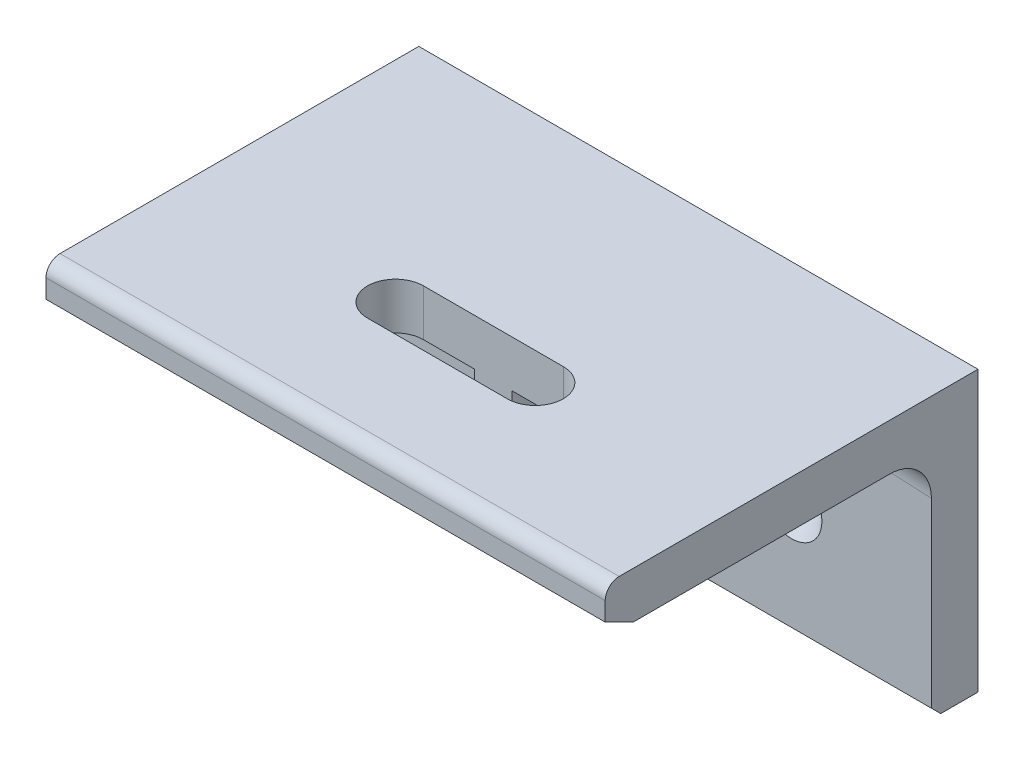
ISO-10303-21;
HEADER;
FILE_DESCRIPTION(('STEP AP214'),'2;1');
FILE_NAME('part.step','',(''),(''),'','','');
FILE_SCHEMA(('AUTOMOTIVE_DESIGN { 1 0 10303 214 1 1 1 1 }'));
ENDSEC;
DATA;
#1=APPLICATION_CONTEXT('core data for automotive mechanical design processes');
#2=APPLICATION_PROTOCOL_DEFINITION('international standard','automotive_design',2000,#1);
#3=PRODUCT_CONTEXT('',#1,'mechanical');
#4=PRODUCT('Part','Part','',(#3));
#5=PRODUCT_RELATED_PRODUCT_CATEGORY('part','',(#4));
#6=PRODUCT_DEFINITION_FORMATION('','',#4);
#7=PRODUCT_DEFINITION_CONTEXT('part definition',#1,'design');
#8=PRODUCT_DEFINITION('design','',#6,#7);
#9=PRODUCT_DEFINITION_SHAPE('','',#8);
#10=(LENGTH_UNIT() NAMED_UNIT(*) SI_UNIT(.MILLI.,.METRE.));
#11=(NAMED_UNIT(*) PLANE_ANGLE_UNIT() SI_UNIT($,.RADIAN.));
#12=(NAMED_UNIT(*) SI_UNIT($,.STERADIAN.) SOLID_ANGLE_UNIT());
#13=UNCERTAINTY_MEASURE_WITH_UNIT(LENGTH_MEASURE(1.E-05),#10,'distance_accuracy_value','');
#14=(GEOMETRIC_REPRESENTATION_CONTEXT(3) GLOBAL_UNCERTAINTY_ASSIGNED_CONTEXT((#13)) GLOBAL_UNIT_ASSIGNED_CONTEXT((#10,
#11,#12)) REPRESENTATION_CONTEXT('',''));
#15=CARTESIAN_POINT('',(0.,0.,0.));
#16=DIRECTION('',(0.,0.,1.));
#17=DIRECTION('',(1.,0.,0.));
#18=AXIS2_PLACEMENT_3D('',#15,#16,#17);
#19=CARTESIAN_POINT('',(64.,10.,10.));
#20=DIRECTION('',(0.,0.78086880944303,-0.624695047554424));
#21=DIRECTION('',(0.,0.624695047554424,0.78086880944303));
#22=AXIS2_PLACEMENT_3D('',#19,#20,#21);
#23=PLANE('',#22);
#24=DIRECTION('',(0.,-0.624695047554424,-0.78086880944303));
#25=VECTOR('',#24,1.);
#26=CARTESIAN_POINT('',(64.,10.,10.));
#27=LINE('',#26,#25);
#28=CARTESIAN_POINT('',(64.,37.2,44.));
#29=VERTEX_POINT('',#28);
#30=CARTESIAN_POINT('',(64.,10.,10.));
#31=VERTEX_POINT('',#30);
#32=EDGE_CURVE('E334',#29,#31,#27,.T.);
#33=ORIENTED_EDGE('',*,*,#32,.F.);
#34=DIRECTION('',(-1.,0.,0.));
#35=VECTOR('',#34,1.);
#36=CARTESIAN_POINT('',(64.,37.2,44.));
#37=LINE('',#36,#35);
#38=CARTESIAN_POINT('',(56.,37.2,44.));
#39=VERTEX_POINT('',#38);
#40=EDGE_CURVE('E272',#29,#39,#37,.T.);
#41=ORIENTED_EDGE('',*,*,#40,.T.);
#42=DIRECTION('',(0.,-0.624695047554424,-0.78086880944303));
#43=VECTOR('',#42,1.);
#44=CARTESIAN_POINT('',(56.,10.,10.));
#45=LINE('',#44,#43);
#46=CARTESIAN_POINT('',(56.,10.,10.));
#47=VERTEX_POINT('',#46);
#48=EDGE_CURVE('E349',#39,#47,#45,.T.);
#49=ORIENTED_EDGE('',*,*,#48,.T.);
#50=DIRECTION('',(-1.,0.,0.));
#51=VECTOR('',#50,1.);
#52=CARTESIAN_POINT('',(64.,10.,10.));
#53=LINE('',#52,#51);
#54=EDGE_CURVE('E344',#31,#47,#53,.T.);
#55=ORIENTED_EDGE('',*,*,#54,.F.);
#56=EDGE_LOOP('',(#33,#41,#49,#55));
#57=FACE_BOUND('',#56,.T.);
#58=ADVANCED_FACE('F71',(#57),#23,.F.);
#59=CARTESIAN_POINT('',(64.,0.,0.));
#60=DIRECTION('',(-1.,0.,0.));
#61=DIRECTION('',(0.,0.,1.));
#62=AXIS2_PLACEMENT_3D('',#59,#60,#61);
#63=PLANE('',#62);
#64=DIRECTION('',(0.,0.,1.));
#65=VECTOR('',#64,1.);
#66=CARTESIAN_POINT('',(64.,50.,60.));
#67=LINE('',#66,#65);
#68=CARTESIAN_POINT('',(64.,50.,16.2));
#69=VERTEX_POINT('',#68);
#70=CARTESIAN_POINT('',(64.,50.,44.));
#71=VERTEX_POINT('',#70);
#72=EDGE_CURVE('E330',#69,#71,#67,.T.);
#73=ORIENTED_EDGE('',*,*,#72,.T.);
#74=DIRECTION('',(0.,-1.,0.));
#75=VECTOR('',#74,1.);
#76=CARTESIAN_POINT('',(64.,0.,44.));
#77=LINE('',#76,#75);
#78=EDGE_CURVE('E280',#71,#29,#77,.T.);
#79=ORIENTED_EDGE('',*,*,#78,.T.);
#80=ORIENTED_EDGE('',*,*,#32,.T.);
#81=DIRECTION('',(0.,1.,0.));
#82=VECTOR('',#81,1.);
#83=CARTESIAN_POINT('',(64.,50.,10.));
#84=LINE('',#83,#82);
#85=CARTESIAN_POINT('',(64.,43.8,10.));
#86=VERTEX_POINT('',#85);
#87=EDGE_CURVE('E340',#31,#86,#84,.T.);
#88=ORIENTED_EDGE('',*,*,#87,.T.);
#89=CARTESIAN_POINT('',(64.,50.,16.2));
#90=CARTESIAN_POINT('',(64.,49.9999687193606,16.0256000696815));
#91=CARTESIAN_POINT('',(64.,49.9925566671614,15.8512007509311));
#92=CARTESIAN_POINT('',(64.,49.9630964198957,15.5036383285874));
#93=CARTESIAN_POINT('',(64.,49.9410478830944,15.3304752539536));
#94=CARTESIAN_POINT('',(64.,49.8824634288315,14.986765556761));
#95=CARTESIAN_POINT('',(64.,49.8459390686207,14.8162169594));
#96=CARTESIAN_POINT('',(64.,49.7587023336513,14.4787724278152));
#97=CARTESIAN_POINT('',(64.,49.7079905668795,14.3118763373974));
#98=CARTESIAN_POINT('',(64.,49.6214918310891,14.0651290822042));
#99=CARTESIAN_POINT('',(64.,49.5908962429059,13.9834255893316));
#100=CARTESIAN_POINT('',(64.,49.5262377182265,13.8214023118593));
#101=CARTESIAN_POINT('',(64.,49.4921747889522,13.7410825243782));
#102=CARTESIAN_POINT('',(64.,49.384936131138,13.5023962976096));
#103=CARTESIAN_POINT('',(64.,49.3066992945905,13.3462709996749));
#104=CARTESIAN_POINT('',(64.,49.1374497723724,13.0411681942608));
#105=CARTESIAN_POINT('',(64.,49.0464395183326,12.8921893335653));
#106=CARTESIAN_POINT('',(64.,48.8521709918913,12.6024466018387));
#107=CARTESIAN_POINT('',(64.,48.7489128230143,12.4616826613868));
#108=CARTESIAN_POINT('',(64.,48.531033502181,12.189346527546));
#109=CARTESIAN_POINT('',(64.,48.4164189462691,12.0577690732743));
#110=CARTESIAN_POINT('',(64.,48.236453493969,11.8680910230294));
#111=CARTESIAN_POINT('',(64.,48.1751177209058,11.8061404176552));
#112=CARTESIAN_POINT('',(64.,48.0498545697312,11.6849169640287));
#113=CARTESIAN_POINT('',(64.,47.9859271670337,11.625644141191));
#114=CARTESIAN_POINT('',(64.,47.7904702478499,11.4519311744386));
#115=CARTESIAN_POINT('',(64.,47.6552579278241,11.341588019893));
#116=CARTESIAN_POINT('',(64.,47.3760764435896,11.1326354487507));
#117=CARTESIAN_POINT('',(64.,47.2321070500518,11.0340263396437));
#118=CARTESIAN_POINT('',(64.,46.9365061962865,10.8493827333324));
#119=CARTESIAN_POINT('',(64.,46.7848829092973,10.763335189114));
#120=CARTESIAN_POINT('',(64.,46.4750271608066,10.604228123879));
#121=CARTESIAN_POINT('',(64.,46.3167946149128,10.5311687687684));
#122=CARTESIAN_POINT('',(64.,45.833794360339,10.3326865298756));
#123=CARTESIAN_POINT('',(64.,45.5002828050437,10.2276833342147));
#124=CARTESIAN_POINT('',(64.,44.9373645673073,10.1011011184141));
#125=CARTESIAN_POINT('',(64.,44.711404632801,10.0632687318992));
#126=CARTESIAN_POINT('',(64.,44.2570154238897,10.0127518556922));
#127=CARTESIAN_POINT('',(64.,44.0285900888762,10.0000319150534));
#128=CARTESIAN_POINT('',(64.,43.8,10.));
#129=B_SPLINE_CURVE_WITH_KNOTS('',3,(#89,#90,#91,#92,#93,#94,#95,#96,#97,#98,#99,#100,#101,#102,
#103,#104,#105,#106,#107,#108,#109,#110,#111,#112,#113,#114,#115,#116,#117,#118,#119,#120,#121,
#122,#123,#124,#125,#126,#127,#128),.UNSPECIFIED.,.F.,.F.,(4,2,2,2,2,2,2,2,2,2,2,2,2,2,2,2,2,2,
2,4),(0.,0.52304863212782,1.04610947690488,1.56875355734358,2.09137524384335,2.35303927932949,
2.61470276982386,3.13792835105721,3.66105446243064,4.1841761524451,4.70699576316886,
4.96845906653275,5.2299248509021,5.75282129755916,6.27573144366113,6.79809454712233,
7.32046432256775,8.3636617836826,9.04973468217064,9.73483836504256),.UNSPECIFIED.);
#130=EDGE_CURVE('E563',#69,#86,#129,.T.);
#131=ORIENTED_EDGE('',*,*,#130,.F.);
#132=EDGE_LOOP('',(#73,#79,#80,#88,#131));
#133=FACE_BOUND('',#132,.T.);
#134=ADVANCED_FACE('F515',(#133),#63,.F.);
#135=CARTESIAN_POINT('',(56.,0.,0.));
#136=DIRECTION('',(-1.,0.,0.));
#137=DIRECTION('',(0.,0.,1.));
#138=AXIS2_PLACEMENT_3D('',#135,#136,#137);
#139=PLANE('',#138);
#140=DIRECTION('',(0.,-1.,0.));
#141=VECTOR('',#140,1.);
#142=CARTESIAN_POINT('',(56.,0.,44.));
#143=LINE('',#142,#141);
#144=CARTESIAN_POINT('',(56.,50.,44.));
#145=VERTEX_POINT('',#144);
#146=EDGE_CURVE('E12',#145,#39,#143,.T.);
#147=ORIENTED_EDGE('',*,*,#146,.F.);
#148=DIRECTION('',(0.,0.,1.));
#149=VECTOR('',#148,1.);
#150=CARTESIAN_POINT('',(56.,50.,60.));
#151=LINE('',#150,#149);
#152=CARTESIAN_POINT('',(56.,50.,15.8));
#153=VERTEX_POINT('',#152);
#154=EDGE_CURVE('E345',#153,#145,#151,.T.);
#155=ORIENTED_EDGE('',*,*,#154,.F.);
#156=CARTESIAN_POINT('',(56.,50.,15.8));
#157=CARTESIAN_POINT('',(56.,49.9999698123251,15.6367878305563));
#158=CARTESIAN_POINT('',(56.,49.9930230369284,15.4735775336246));
#159=CARTESIAN_POINT('',(56.,49.9654267458737,15.1483125953991));
#160=CARTESIAN_POINT('',(56.,49.9447766901956,14.9862579999037));
#161=CARTESIAN_POINT('',(56.,49.889926390727,14.6645989880676));
#162=CARTESIAN_POINT('',(56.,49.8557370720924,14.5049927037239));
#163=CARTESIAN_POINT('',(56.,49.7740774607814,14.1891998314571));
#164=CARTESIAN_POINT('',(56.,49.7266078329068,14.0330130727769));
#165=CARTESIAN_POINT('',(56.,49.6456415930831,13.8021275281607));
#166=CARTESIAN_POINT('',(56.,49.6170079766656,13.7256915344572));
#167=CARTESIAN_POINT('',(56.,49.5564931514772,13.5741161870847));
#168=CARTESIAN_POINT('',(56.,49.5246121566572,13.498976748374));
#169=CARTESIAN_POINT('',(56.,49.4576968426586,13.3501220840879));
#170=CARTESIAN_POINT('',(56.,49.4226627288936,13.2764067661159));
#171=CARTESIAN_POINT('',(56.,49.349521895196,13.1304984824724));
#172=CARTESIAN_POINT('',(56.,49.3114143870217,13.0583059133719));
#173=CARTESIAN_POINT('',(56.,49.1926282354906,12.8442754259403));
#174=CARTESIAN_POINT('',(56.,49.1074488422748,12.7049022439573));
#175=CARTESIAN_POINT('',(56.,48.9256451504002,12.4338314223232));
#176=CARTESIAN_POINT('',(56.,48.82902080854,12.3021338116478));
#177=CARTESIAN_POINT('',(56.,48.6761177860708,12.1110498477638));
#178=CARTESIAN_POINT('',(56.,48.6238260181618,12.0484361284615));
#179=CARTESIAN_POINT('',(56.,48.5166617022356,11.9254796295041));
#180=CARTESIAN_POINT('',(56.,48.4617898414703,11.8651362527273));
#181=CARTESIAN_POINT('',(56.,48.3495186152548,11.7468385062648));
#182=CARTESIAN_POINT('',(56.,48.2921190518309,11.6888843243953));
#183=CARTESIAN_POINT('',(56.,48.1748926226425,11.5754846682123));
#184=CARTESIAN_POINT('',(56.,48.1150655788279,11.5200393785535));
#185=CARTESIAN_POINT('',(56.,47.9321475595628,11.3575521277766));
#186=CARTESIAN_POINT('',(56.,47.8056080670138,11.2543465564257));
#187=CARTESIAN_POINT('',(56.,47.5443423676488,11.0589113819521));
#188=CARTESIAN_POINT('',(56.,47.4096158713791,10.9666821672427));
#189=CARTESIAN_POINT('',(56.,47.1330506232434,10.7940040318033));
#190=CARTESIAN_POINT('',(56.,46.9912219050723,10.7135390881155));
#191=CARTESIAN_POINT('',(56.,46.7013852425205,10.5647580067909));
#192=CARTESIAN_POINT('',(56.,46.5533772861838,10.4964418926618));
#193=CARTESIAN_POINT('',(56.,46.101583197971,10.3108732596978));
#194=CARTESIAN_POINT('',(56.,45.7896146105848,10.2127424529802));
#195=CARTESIAN_POINT('',(56.,45.2631992350405,10.0944716201633));
#196=CARTESIAN_POINT('',(56.,45.0519722214342,10.0591287850869));
#197=CARTESIAN_POINT('',(56.,44.6272132565672,10.0119279648559));
#198=CARTESIAN_POINT('',(56.,44.4136849749097,10.0000369387421));
#199=CARTESIAN_POINT('',(56.,44.2,10.));
#200=B_SPLINE_CURVE_WITH_KNOTS('',3,(#156,#157,#158,#159,#160,#161,#162,#163,#164,#165,#166,
#167,#168,#169,#170,#171,#172,#173,#174,#175,#176,#177,#178,#179,#180,#181,#182,#183,#184,#185,
#186,#187,#188,#189,#190,#191,#192,#193,#194,#195,#196,#197,#198,#199),.UNSPECIFIED.,.F.,.F.,(4,
2,2,2,2,2,2,2,2,2,2,2,2,2,2,2,2,2,2,2,2,4),(0.,0.489492787772861,0.979004866665044,
1.46812274877271,1.95721615040252,2.20202446316101,2.44681665734466,2.6915929157884,
2.93643215352087,3.42584013348549,3.91524996087671,4.15992306868802,4.40453136878341,
4.6491588611746,4.89380432899015,5.38304480062153,5.87230257955193,6.3608876534714,
6.84947367277912,7.82520500308838,8.4665374524848,9.10696568933493),.UNSPECIFIED.);
#201=CARTESIAN_POINT('',(56.,44.2,10.));
#202=VERTEX_POINT('',#201);
#203=EDGE_CURVE('E387',#153,#202,#200,.T.);
#204=ORIENTED_EDGE('',*,*,#203,.T.);
#205=DIRECTION('',(0.,1.,0.));
#206=VECTOR('',#205,1.);
#207=CARTESIAN_POINT('',(56.,50.,10.));
#208=LINE('',#207,#206);
#209=EDGE_CURVE('E354',#47,#202,#208,.T.);
#210=ORIENTED_EDGE('',*,*,#209,.F.);
#211=ORIENTED_EDGE('',*,*,#48,.F.);
#212=EDGE_LOOP('',(#147,#155,#204,#210,#211));
#213=FACE_BOUND('',#212,.T.);
#214=ADVANCED_FACE('F483',(#213),#139,.T.);
#215=CARTESIAN_POINT('',(120.,50.,80.));
#216=DIRECTION('',(0.,1.,0.));
#217=DIRECTION('',(0.,0.,1.));
#218=AXIS2_PLACEMENT_3D('',#215,#216,#217);
#219=PLANE('',#218);
#220=ORIENTED_EDGE('',*,*,#154,.T.);
#221=DIRECTION('',(-1.,0.,0.));
#222=VECTOR('',#221,1.);
#223=CARTESIAN_POINT('',(120.,50.,44.));
#224=LINE('',#223,#222);
#225=CARTESIAN_POINT('',(45.,50.,44.));
#226=VERTEX_POINT('',#225);
#227=EDGE_CURVE('E276',#145,#226,#224,.T.);
#228=ORIENTED_EDGE('',*,*,#227,.T.);
#229=CARTESIAN_POINT('',(45.,50.,50.));
#230=DIRECTION('',(0.,1.,0.));
#231=DIRECTION('',(0.,0.,1.));
#232=AXIS2_PLACEMENT_3D('',#229,#230,#231);
#233=CIRCLE('',#232,6.);
#234=CARTESIAN_POINT('',(45.,50.,56.));
#235=VERTEX_POINT('',#234);
#236=EDGE_CURVE('E287',#226,#235,#233,.T.);
#237=ORIENTED_EDGE('',*,*,#236,.T.);
#238=DIRECTION('',(1.,0.,0.));
#239=VECTOR('',#238,1.);
#240=CARTESIAN_POINT('',(120.,50.,56.));
#241=LINE('',#240,#239);
#242=CARTESIAN_POINT('',(56.,50.,56.));
#243=VERTEX_POINT('',#242);
#244=EDGE_CURVE('E263',#235,#243,#241,.T.);
#245=ORIENTED_EDGE('',*,*,#244,.T.);
#246=CARTESIAN_POINT('',(56.,50.,60.));
#247=VERTEX_POINT('',#246);
#248=EDGE_CURVE('E329',#243,#247,#151,.T.);
#249=ORIENTED_EDGE('',*,*,#248,.T.);
#250=DIRECTION('',(-1.,0.,0.));
#251=VECTOR('',#250,1.);
#252=CARTESIAN_POINT('',(64.,50.,60.));
#253=LINE('',#252,#251);
#254=CARTESIAN_POINT('',(64.,50.,60.));
#255=VERTEX_POINT('',#254);
#256=EDGE_CURVE('E361',#255,#247,#253,.T.);
#257=ORIENTED_EDGE('',*,*,#256,.F.);
#258=CARTESIAN_POINT('',(64.,50.,56.));
#259=VERTEX_POINT('',#258);
#260=EDGE_CURVE('E335',#259,#255,#67,.T.);
#261=ORIENTED_EDGE('',*,*,#260,.F.);
#262=CARTESIAN_POINT('',(75.,50.,56.));
#263=VERTEX_POINT('',#262);
#264=EDGE_CURVE('E268',#259,#263,#241,.T.);
#265=ORIENTED_EDGE('',*,*,#264,.T.);
#266=CARTESIAN_POINT('',(75.,50.,50.));
#267=DIRECTION('',(0.,1.,0.));
#268=DIRECTION('',(0.,0.,1.));
#269=AXIS2_PLACEMENT_3D('',#266,#267,#268);
#270=CIRCLE('',#269,6.);
#271=CARTESIAN_POINT('',(75.,50.,44.));
#272=VERTEX_POINT('',#271);
#273=EDGE_CURVE('E230',#263,#272,#270,.T.);
#274=ORIENTED_EDGE('',*,*,#273,.T.);
#275=EDGE_CURVE('E281',#272,#71,#224,.T.);
#276=ORIENTED_EDGE('',*,*,#275,.T.);
#277=ORIENTED_EDGE('',*,*,#72,.F.);
#278=DIRECTION('',(0.998752338877845,0.,0.0499376169438922));
#279=VECTOR('',#278,1.);
#280=CARTESIAN_POINT('',(0.,50.,13.));
#281=LINE('',#280,#279);
#282=CARTESIAN_POINT('',(120.,50.,19.));
#283=VERTEX_POINT('',#282);
#284=EDGE_CURVE('E369',#69,#283,#281,.T.);
#285=ORIENTED_EDGE('',*,*,#284,.T.);
#286=DIRECTION('',(0.,0.,-1.));
#287=VECTOR('',#286,1.);
#288=CARTESIAN_POINT('',(120.,50.,80.));
#289=LINE('',#288,#287);
#290=CARTESIAN_POINT('',(120.,50.,74.));
#291=VERTEX_POINT('',#290);
#292=EDGE_CURVE('E564',#291,#283,#289,.T.);
#293=ORIENTED_EDGE('',*,*,#292,.F.);
#294=DIRECTION('',(-1.,0.,0.));
#295=VECTOR('',#294,1.);
#296=CARTESIAN_POINT('',(120.,50.,74.));
#297=LINE('',#296,#295);
#298=CARTESIAN_POINT('',(0.,50.,74.));
#299=VERTEX_POINT('',#298);
#300=EDGE_CURVE('E325',#291,#299,#297,.T.);
#301=ORIENTED_EDGE('',*,*,#300,.T.);
#302=DIRECTION('',(0.,0.,-1.));
#303=VECTOR('',#302,1.);
#304=CARTESIAN_POINT('',(0.,50.,80.));
#305=LINE('',#304,#303);
#306=CARTESIAN_POINT('',(0.,50.,13.));
#307=VERTEX_POINT('',#306);
#308=EDGE_CURVE('E570',#299,#307,#305,.T.);
#309=ORIENTED_EDGE('',*,*,#308,.T.);
#310=EDGE_CURVE('E373',#307,#153,#281,.T.);
#311=ORIENTED_EDGE('',*,*,#310,.T.);
#312=EDGE_LOOP('',(#220,#228,#237,#245,#249,#257,#261,#265,#274,#276,#277,#285,#293,#301,#309,#311));
#313=FACE_BOUND('',#312,.T.);
#314=ADVANCED_FACE('F477',(#313),#219,.F.);
#315=CARTESIAN_POINT('',(120.,60.,80.));
#316=DIRECTION('',(0.,0.,-1.));
#317=DIRECTION('',(-1.,0.,0.));
#318=AXIS2_PLACEMENT_3D('',#315,#316,#317);
#319=PLANE('',#318);
#320=DIRECTION('',(0.,-1.,0.));
#321=VECTOR('',#320,1.);
#322=CARTESIAN_POINT('',(120.,60.,80.));
#323=LINE('',#322,#321);
#324=CARTESIAN_POINT('',(120.,57.,80.));
#325=VERTEX_POINT('',#324);
#326=CARTESIAN_POINT('',(120.,53.,80.));
#327=VERTEX_POINT('',#326);
#328=EDGE_CURVE('E569',#325,#327,#323,.T.);
#329=ORIENTED_EDGE('',*,*,#328,.F.);
#330=DIRECTION('',(-1.,0.,0.));
#331=VECTOR('',#330,1.);
#332=CARTESIAN_POINT('',(120.,57.,80.));
#333=LINE('',#332,#331);
#334=CARTESIAN_POINT('',(0.,57.,80.));
#335=VERTEX_POINT('',#334);
#336=EDGE_CURVE('E559',#325,#335,#333,.T.);
#337=ORIENTED_EDGE('',*,*,#336,.T.);
#338=DIRECTION('',(0.,-1.,0.));
#339=VECTOR('',#338,1.);
#340=CARTESIAN_POINT('',(0.,60.,80.));
#341=LINE('',#340,#339);
#342=CARTESIAN_POINT('',(0.,53.,80.));
#343=VERTEX_POINT('',#342);
#344=EDGE_CURVE('E644',#335,#343,#341,.T.);
#345=ORIENTED_EDGE('',*,*,#344,.T.);
#346=DIRECTION('',(-1.,0.,0.));
#347=VECTOR('',#346,1.);
#348=CARTESIAN_POINT('',(120.,53.,80.));
#349=LINE('',#348,#347);
#350=EDGE_CURVE('E318',#327,#343,#349,.T.);
#351=ORIENTED_EDGE('',*,*,#350,.F.);
#352=EDGE_LOOP('',(#329,#337,#345,#351));
#353=FACE_BOUND('',#352,.T.);
#354=ADVANCED_FACE('F482',(#353),#319,.F.);
#355=CARTESIAN_POINT('',(120.,0.,0.));
#356=DIRECTION('',(1.,0.,0.));
#357=DIRECTION('',(0.,0.,-1.));
#358=AXIS2_PLACEMENT_3D('',#355,#356,#357);
#359=PLANE('',#358);
#360=DIRECTION('',(0.,-1.,0.));
#361=VECTOR('',#360,1.);
#362=CARTESIAN_POINT('',(120.,50.,10.));
#363=LINE('',#362,#361);
#364=CARTESIAN_POINT('',(120.,41.,10.));
#365=VERTEX_POINT('',#364);
#366=CARTESIAN_POINT('',(120.,2.,10.));
#367=VERTEX_POINT('',#366);
#368=EDGE_CURVE('E568',#365,#367,#363,.T.);
#369=ORIENTED_EDGE('',*,*,#368,.T.);
#370=DIRECTION('',(0.,0.70710678118655,0.707106781186545));
#371=VECTOR('',#370,1.);
#372=CARTESIAN_POINT('',(120.,-4.00000000000001,4.00000000000003));
#373=LINE('',#372,#371);
#374=CARTESIAN_POINT('',(120.,0.,8.00000000000001));
#375=VERTEX_POINT('',#374);
#376=EDGE_CURVE('E534',#367,#375,#373,.F.);
#377=ORIENTED_EDGE('',*,*,#376,.T.);
#378=DIRECTION('',(0.,0.,-1.));
#379=VECTOR('',#378,1.);
#380=CARTESIAN_POINT('',(120.,0.,10.));
#381=LINE('',#380,#379);
#382=CARTESIAN_POINT('',(120.,0.,0.));
#383=VERTEX_POINT('',#382);
#384=EDGE_CURVE('E589',#375,#383,#381,.T.);
#385=ORIENTED_EDGE('',*,*,#384,.T.);
#386=DIRECTION('',(0.,1.,0.));
#387=VECTOR('',#386,1.);
#388=CARTESIAN_POINT('',(120.,0.,0.));
#389=LINE('',#388,#387);
#390=CARTESIAN_POINT('',(120.,60.,0.));
#391=VERTEX_POINT('',#390);
#392=EDGE_CURVE('E918',#383,#391,#389,.T.);
#393=ORIENTED_EDGE('',*,*,#392,.T.);
#394=DIRECTION('',(0.,0.,1.));
#395=VECTOR('',#394,1.);
#396=CARTESIAN_POINT('',(120.,60.,0.));
#397=LINE('',#396,#395);
#398=CARTESIAN_POINT('',(120.,60.,77.));
#399=VERTEX_POINT('',#398);
#400=EDGE_CURVE('E915',#391,#399,#397,.T.);
#401=ORIENTED_EDGE('',*,*,#400,.T.);
#402=CARTESIAN_POINT('',(120.,57.,77.));
#403=DIRECTION('',(1.,0.,0.));
#404=DIRECTION('',(0.,0.,-1.));
#405=AXIS2_PLACEMENT_3D('',#402,#403,#404);
#406=CIRCLE('',#405,3.);
#407=EDGE_CURVE('E550',#399,#325,#406,.T.);
#408=ORIENTED_EDGE('',*,*,#407,.T.);
#409=ORIENTED_EDGE('',*,*,#328,.T.);
#410=DIRECTION('',(0.,0.447213595499957,0.894427190999916));
#411=VECTOR('',#410,1.);
#412=CARTESIAN_POINT('',(120.,50.,74.));
#413=LINE('',#412,#411);
#414=EDGE_CURVE('E314',#291,#327,#413,.T.);
#415=ORIENTED_EDGE('',*,*,#414,.F.);
#416=ORIENTED_EDGE('',*,*,#292,.T.);
#417=CARTESIAN_POINT('',(120.,41.,19.));
#418=DIRECTION('',(-1.,0.,0.));
#419=DIRECTION('',(0.,0.,-1.));
#420=AXIS2_PLACEMENT_3D('',#417,#418,#419);
#421=CIRCLE('',#420,9.00000000000001);
#422=EDGE_CURVE('E453',#283,#365,#421,.T.);
#423=ORIENTED_EDGE('',*,*,#422,.T.);
#424=EDGE_LOOP('',(#369,#377,#385,#393,#401,#408,#409,#415,#416,#423));
#425=FACE_BOUND('',#424,.T.);
#426=ADVANCED_FACE('F426',(#425),#359,.T.);
#427=CARTESIAN_POINT('',(0.,0.,0.));
#428=DIRECTION('',(1.,0.,0.));
#429=DIRECTION('',(0.,0.,-1.));
#430=AXIS2_PLACEMENT_3D('',#427,#428,#429);
#431=PLANE('',#430);
#432=DIRECTION('',(0.,0.,-1.));
#433=VECTOR('',#432,1.);
#434=CARTESIAN_POINT('',(0.,0.,10.));
#435=LINE('',#434,#433);
#436=CARTESIAN_POINT('',(0.,0.,8.00000000000001));
#437=VERTEX_POINT('',#436);
#438=CARTESIAN_POINT('',(0.,0.,0.));
#439=VERTEX_POINT('',#438);
#440=EDGE_CURVE('E578',#437,#439,#435,.T.);
#441=ORIENTED_EDGE('',*,*,#440,.F.);
#442=DIRECTION('',(0.,-0.70710678118655,-0.707106781186545));
#443=VECTOR('',#442,1.);
#444=CARTESIAN_POINT('',(0.,0.,8.00000000000001));
#445=LINE('',#444,#443);
#446=CARTESIAN_POINT('',(0.,2.,10.));
#447=VERTEX_POINT('',#446);
#448=EDGE_CURVE('E543',#437,#447,#445,.F.);
#449=ORIENTED_EDGE('',*,*,#448,.T.);
#450=DIRECTION('',(0.,-1.,0.));
#451=VECTOR('',#450,1.);
#452=CARTESIAN_POINT('',(0.,50.,10.));
#453=LINE('',#452,#451);
#454=CARTESIAN_POINT('',(0.,47.,10.));
#455=VERTEX_POINT('',#454);
#456=EDGE_CURVE('E584',#455,#447,#453,.T.);
#457=ORIENTED_EDGE('',*,*,#456,.F.);
#458=CARTESIAN_POINT('',(0.,47.,13.));
#459=DIRECTION('',(-1.,0.,0.));
#460=DIRECTION('',(0.,0.,-1.));
#461=AXIS2_PLACEMENT_3D('',#458,#459,#460);
#462=CIRCLE('',#461,3.);
#463=EDGE_CURVE('E365',#307,#455,#462,.T.);
#464=ORIENTED_EDGE('',*,*,#463,.F.);
#465=ORIENTED_EDGE('',*,*,#308,.F.);
#466=DIRECTION('',(0.,0.447213595499957,0.894427190999916));
#467=VECTOR('',#466,1.);
#468=CARTESIAN_POINT('',(0.,50.,74.));
#469=LINE('',#468,#467);
#470=EDGE_CURVE('E310',#299,#343,#469,.T.);
#471=ORIENTED_EDGE('',*,*,#470,.T.);
#472=ORIENTED_EDGE('',*,*,#344,.F.);
#473=CARTESIAN_POINT('',(0.,57.,77.));
#474=DIRECTION('',(1.,0.,0.));
#475=DIRECTION('',(0.,0.,-1.));
#476=AXIS2_PLACEMENT_3D('',#473,#474,#475);
#477=CIRCLE('',#476,3.);
#478=CARTESIAN_POINT('',(0.,60.,77.));
#479=VERTEX_POINT('',#478);
#480=EDGE_CURVE('E556',#335,#479,#477,.F.);
#481=ORIENTED_EDGE('',*,*,#480,.T.);
#482=DIRECTION('',(0.,0.,1.));
#483=VECTOR('',#482,1.);
#484=CARTESIAN_POINT('',(0.,60.,0.));
#485=LINE('',#484,#483);
#486=CARTESIAN_POINT('',(0.,60.,0.));
#487=VERTEX_POINT('',#486);
#488=EDGE_CURVE('E642',#487,#479,#485,.T.);
#489=ORIENTED_EDGE('',*,*,#488,.F.);
#490=DIRECTION('',(0.,1.,0.));
#491=VECTOR('',#490,1.);
#492=CARTESIAN_POINT('',(0.,0.,0.));
#493=LINE('',#492,#491);
#494=EDGE_CURVE('E638',#439,#487,#493,.T.);
#495=ORIENTED_EDGE('',*,*,#494,.F.);
#496=EDGE_LOOP('',(#441,#449,#457,#464,#465,#471,#472,#481,#489,#495));
#497=FACE_BOUND('',#496,.T.);
#498=ADVANCED_FACE('F463',(#497),#431,.F.);
#499=CARTESIAN_POINT('',(120.,50.,10.));
#500=DIRECTION('',(0.,0.,-1.));
#501=DIRECTION('',(-1.,0.,0.));
#502=AXIS2_PLACEMENT_3D('',#499,#500,#501);
#503=PLANE('',#502);
#504=CARTESIAN_POINT('',(30.,25.,10.));
#505=DIRECTION('',(0.,0.,1.));
#506=DIRECTION('',(1.,0.,0.));
#507=AXIS2_PLACEMENT_3D('',#504,#505,#506);
#508=CIRCLE('',#507,6.5);
#509=CARTESIAN_POINT('',(36.5,25.,10.));
#510=VERTEX_POINT('',#509);
#511=EDGE_CURVE('E306',#510,#510,#508,.T.);
#512=ORIENTED_EDGE('',*,*,#511,.F.);
#513=EDGE_LOOP('',(#512));
#514=FACE_BOUND('',#513,.T.);
#515=CARTESIAN_POINT('',(90.,25.,10.));
#516=DIRECTION('',(0.,0.,1.));
#517=DIRECTION('',(1.,0.,0.));
#518=AXIS2_PLACEMENT_3D('',#515,#516,#517);
#519=CIRCLE('',#518,6.50000000000001);
#520=CARTESIAN_POINT('',(96.5,25.,10.));
#521=VERTEX_POINT('',#520);
#522=EDGE_CURVE('E305',#521,#521,#519,.T.);
#523=ORIENTED_EDGE('',*,*,#522,.F.);
#524=EDGE_LOOP('',(#523));
#525=FACE_BOUND('',#524,.T.);
#526=ORIENTED_EDGE('',*,*,#456,.T.);
#527=DIRECTION('',(1.,0.,0.));
#528=VECTOR('',#527,1.);
#529=CARTESIAN_POINT('',(120.,2.,10.));
#530=LINE('',#529,#528);
#531=EDGE_CURVE('E538',#447,#367,#530,.T.);
#532=ORIENTED_EDGE('',*,*,#531,.T.);
#533=ORIENTED_EDGE('',*,*,#368,.F.);
#534=DIRECTION('',(0.998752338877845,-0.0499376169438922,0.));
#535=VECTOR('',#534,1.);
#536=CARTESIAN_POINT('',(0.,47.,10.));
#537=LINE('',#536,#535);
#538=EDGE_CURVE('E370',#86,#365,#537,.T.);
#539=ORIENTED_EDGE('',*,*,#538,.F.);
#540=ORIENTED_EDGE('',*,*,#87,.F.);
#541=ORIENTED_EDGE('',*,*,#54,.T.);
#542=ORIENTED_EDGE('',*,*,#209,.T.);
#543=EDGE_CURVE('E366',#455,#202,#537,.T.);
#544=ORIENTED_EDGE('',*,*,#543,.F.);
#545=EDGE_LOOP('',(#526,#532,#533,#539,#540,#541,#542,#544));
#546=FACE_BOUND('',#545,.T.);
#547=ADVANCED_FACE('F472',(#514,#525,#546),#503,.F.);
#548=CARTESIAN_POINT('',(0.,50.,13.));
#549=CARTESIAN_POINT('',(120.,50.,19.));
#550=CARTESIAN_POINT('',(0.,50.,12.8232233047034));
#551=CARTESIAN_POINT('',(120.,50.,18.4696699141101));
#552=CARTESIAN_POINT('',(0.,49.9838909458899,12.6394749853199));
#553=CARTESIAN_POINT('',(120.,49.9528548745652,17.9195073583385));
#554=CARTESIAN_POINT('',(0.,49.9151231175766,12.2680439814133));
#555=CARTESIAN_POINT('',(120.,49.7466417569332,16.8051576982429));
#556=CARTESIAN_POINT('',(0.,49.8624643433734,12.0803612968902));
#557=CARTESIAN_POINT('',(120.,49.5873930301202,16.2410838906706));
#558=CARTESIAN_POINT('',(0.,49.7162654630012,11.7110704457386));
#559=CARTESIAN_POINT('',(120.,49.1487963890035,15.1332113372157));
#560=CARTESIAN_POINT('',(0.,49.6224776277976,11.5300346967234));
#561=CARTESIAN_POINT('',(120.,48.8693449899168,14.5896371505096));
#562=CARTESIAN_POINT('',(0.,49.3982283727802,11.1870626067777));
#563=CARTESIAN_POINT('',(120.,48.1965742120189,13.5605872885578));
#564=CARTESIAN_POINT('',(0.,49.2677669529664,11.0251262658471));
#565=CARTESIAN_POINT('',(120.,47.8033008588991,13.0753787975413));
#566=CARTESIAN_POINT('',(0.,48.9748737341529,10.7322330470336));
#567=CARTESIAN_POINT('',(120.,46.9246212024588,12.1966991411009));
#568=CARTESIAN_POINT('',(0.,48.8129373932223,10.6017716272198));
#569=CARTESIAN_POINT('',(120.,46.4394127114422,11.8034257879811));
#570=CARTESIAN_POINT('',(0.,48.4699653032766,10.3775223722024));
#571=CARTESIAN_POINT('',(120.,45.4103628494903,11.1306550100832));
#572=CARTESIAN_POINT('',(0.,48.2889295542615,10.2837345369988));
#573=CARTESIAN_POINT('',(120.,44.8667886627843,10.8512036109965));
#574=CARTESIAN_POINT('',(0.,47.9196387031098,10.1375356566266));
#575=CARTESIAN_POINT('',(120.,43.7589161093294,10.4126069698798));
#576=CARTESIAN_POINT('',(0.,47.7319560185867,10.0848768824234));
#577=CARTESIAN_POINT('',(120.,43.1948423017571,10.2533582430668));
#578=CARTESIAN_POINT('',(0.,47.3605250146801,10.0161090541101));
#579=CARTESIAN_POINT('',(120.,42.0804926416615,10.0471451254348));
#580=CARTESIAN_POINT('',(0.,47.1767766952966,10.));
#581=CARTESIAN_POINT('',(120.,41.5303300858899,10.));
#582=CARTESIAN_POINT('',(0.,47.,10.));
#583=CARTESIAN_POINT('',(120.,41.,10.));
#584=B_SPLINE_SURFACE_WITH_KNOTS('',3,1,((#548,#549),(#550,#551),(#552,#553),(#554,#555),(#556,
#557),(#558,#559),(#560,#561),(#562,#563),(#564,#565),(#566,#567),(#568,#569),(#570,#571),(#572,
#573),(#574,#575),(#576,#577),(#578,#579),(#580,#581),(#582,#583)),.UNSPECIFIED.,.F.,.F.,.F.,(4,
2,2,2,2,2,2,2,4),(2,2),(0.,0.125,0.25,0.375,0.5,0.625,0.75,0.875,1.),(0.,1.),.UNSPECIFIED.);
#585=ORIENTED_EDGE('',*,*,#284,.F.);
#586=ORIENTED_EDGE('',*,*,#130,.T.);
#587=ORIENTED_EDGE('',*,*,#538,.T.);
#588=ORIENTED_EDGE('',*,*,#422,.F.);
#589=EDGE_LOOP('',(#585,#586,#587,#588));
#590=FACE_BOUND('',#589,.T.);
#591=ADVANCED_FACE('F423',(#590),#584,.T.);
#592=CARTESIAN_POINT('',(120.,0.,10.));
#593=DIRECTION('',(0.,1.,0.));
#594=DIRECTION('',(0.,0.,1.));
#595=AXIS2_PLACEMENT_3D('',#592,#593,#594);
#596=PLANE('',#595);
#597=ORIENTED_EDGE('',*,*,#384,.F.);
#598=DIRECTION('',(-1.,0.,0.));
#599=VECTOR('',#598,1.);
#600=CARTESIAN_POINT('',(120.,0.,8.00000000000001));
#601=LINE('',#600,#599);
#602=EDGE_CURVE('E546',#375,#437,#601,.T.);
#603=ORIENTED_EDGE('',*,*,#602,.T.);
#604=ORIENTED_EDGE('',*,*,#440,.T.);
#605=DIRECTION('',(-1.,0.,0.));
#606=VECTOR('',#605,1.);
#607=CARTESIAN_POINT('',(120.,0.,0.));
#608=LINE('',#607,#606);
#609=EDGE_CURVE('E590',#383,#439,#608,.T.);
#610=ORIENTED_EDGE('',*,*,#609,.F.);
#611=EDGE_LOOP('',(#597,#603,#604,#610));
#612=FACE_BOUND('',#611,.T.);
#613=ADVANCED_FACE('F495',(#612),#596,.F.);
#614=CARTESIAN_POINT('',(120.,0.,0.));
#615=DIRECTION('',(0.,0.,1.));
#616=DIRECTION('',(1.,0.,0.));
#617=AXIS2_PLACEMENT_3D('',#614,#615,#616);
#618=PLANE('',#617);
#619=CARTESIAN_POINT('',(30.,25.,0.));
#620=DIRECTION('',(0.,0.,1.));
#621=DIRECTION('',(1.,0.,0.));
#622=AXIS2_PLACEMENT_3D('',#619,#620,#621);
#623=CIRCLE('',#622,3.3);
#624=CARTESIAN_POINT('',(33.3,25.,0.));
#625=VERTEX_POINT('',#624);
#626=EDGE_CURVE('E292',#625,#625,#623,.T.);
#627=ORIENTED_EDGE('',*,*,#626,.T.);
#628=EDGE_LOOP('',(#627));
#629=FACE_BOUND('',#628,.T.);
#630=CARTESIAN_POINT('',(90.,25.,0.));
#631=DIRECTION('',(0.,0.,1.));
#632=DIRECTION('',(1.,0.,0.));
#633=AXIS2_PLACEMENT_3D('',#630,#631,#632);
#634=CIRCLE('',#633,3.3);
#635=CARTESIAN_POINT('',(93.3,25.,0.));
#636=VERTEX_POINT('',#635);
#637=EDGE_CURVE('E291',#636,#636,#634,.T.);
#638=ORIENTED_EDGE('',*,*,#637,.T.);
#639=EDGE_LOOP('',(#638));
#640=FACE_BOUND('',#639,.T.);
#641=ORIENTED_EDGE('',*,*,#494,.T.);
#642=DIRECTION('',(-1.,0.,0.));
#643=VECTOR('',#642,1.);
#644=CARTESIAN_POINT('',(120.,60.,0.));
#645=LINE('',#644,#643);
#646=EDGE_CURVE('E583',#391,#487,#645,.T.);
#647=ORIENTED_EDGE('',*,*,#646,.F.);
#648=ORIENTED_EDGE('',*,*,#392,.F.);
#649=ORIENTED_EDGE('',*,*,#609,.T.);
#650=EDGE_LOOP('',(#641,#647,#648,#649));
#651=FACE_BOUND('',#650,.T.);
#652=ADVANCED_FACE('F492',(#629,#640,#651),#618,.F.);
#653=CARTESIAN_POINT('',(120.,60.,0.));
#654=DIRECTION('',(0.,-1.,0.));
#655=DIRECTION('',(0.,0.,-1.));
#656=AXIS2_PLACEMENT_3D('',#653,#654,#655);
#657=PLANE('',#656);
#658=DIRECTION('',(1.,0.,0.));
#659=VECTOR('',#658,1.);
#660=CARTESIAN_POINT('',(75.,60.,56.));
#661=LINE('',#660,#659);
#662=CARTESIAN_POINT('',(45.,60.,56.));
#663=VERTEX_POINT('',#662);
#664=CARTESIAN_POINT('',(75.,60.,56.));
#665=VERTEX_POINT('',#664);
#666=EDGE_CURVE('E237',#663,#665,#661,.T.);
#667=ORIENTED_EDGE('',*,*,#666,.F.);
#668=CARTESIAN_POINT('',(45.,60.,50.));
#669=DIRECTION('',(0.,1.,0.));
#670=DIRECTION('',(0.,0.,-1.));
#671=AXIS2_PLACEMENT_3D('',#668,#669,#670);
#672=CIRCLE('',#671,6.);
#673=CARTESIAN_POINT('',(45.,60.,44.));
#674=VERTEX_POINT('',#673);
#675=EDGE_CURVE('E88',#674,#663,#672,.T.);
#676=ORIENTED_EDGE('',*,*,#675,.F.);
#677=DIRECTION('',(-1.,0.,0.));
#678=VECTOR('',#677,1.);
#679=CARTESIAN_POINT('',(45.,60.,44.));
#680=LINE('',#679,#678);
#681=CARTESIAN_POINT('',(75.,60.,44.));
#682=VERTEX_POINT('',#681);
#683=EDGE_CURVE('E245',#682,#674,#680,.T.);
#684=ORIENTED_EDGE('',*,*,#683,.F.);
#685=CARTESIAN_POINT('',(75.,60.,50.));
#686=DIRECTION('',(0.,1.,0.));
#687=DIRECTION('',(0.,0.,-1.));
#688=AXIS2_PLACEMENT_3D('',#685,#686,#687);
#689=CIRCLE('',#688,6.);
#690=EDGE_CURVE('E227',#665,#682,#689,.T.);
#691=ORIENTED_EDGE('',*,*,#690,.F.);
#692=EDGE_LOOP('',(#667,#676,#684,#691));
#693=FACE_BOUND('',#692,.T.);
#694=ORIENTED_EDGE('',*,*,#488,.T.);
#695=DIRECTION('',(-1.,0.,0.));
#696=VECTOR('',#695,1.);
#697=CARTESIAN_POINT('',(120.,60.,77.));
#698=LINE('',#697,#696);
#699=EDGE_CURVE('E553',#479,#399,#698,.F.);
#700=ORIENTED_EDGE('',*,*,#699,.T.);
#701=ORIENTED_EDGE('',*,*,#400,.F.);
#702=ORIENTED_EDGE('',*,*,#646,.T.);
#703=EDGE_LOOP('',(#694,#700,#701,#702));
#704=FACE_BOUND('',#703,.T.);
#705=ADVANCED_FACE('F242',(#693,#704),#657,.F.);
#706=ORIENTED_EDGE('',*,*,#203,.F.);
#707=ORIENTED_EDGE('',*,*,#310,.F.);
#708=ORIENTED_EDGE('',*,*,#463,.T.);
#709=ORIENTED_EDGE('',*,*,#543,.T.);
#710=EDGE_LOOP('',(#706,#707,#708,#709));
#711=FACE_BOUND('',#710,.T.);
#712=ADVANCED_FACE('F409',(#711),#584,.T.);
#713=CARTESIAN_POINT('',(56.,46.8,56.));
#714=VERTEX_POINT('',#713);
#715=EDGE_CURVE('E350',#247,#714,#45,.T.);
#716=ORIENTED_EDGE('',*,*,#715,.T.);
#717=DIRECTION('',(1.,0.,0.));
#718=VECTOR('',#717,1.);
#719=CARTESIAN_POINT('',(64.,46.8,56.));
#720=LINE('',#719,#718);
#721=CARTESIAN_POINT('',(64.,46.8,56.));
#722=VERTEX_POINT('',#721);
#723=EDGE_CURVE('E96',#714,#722,#720,.T.);
#724=ORIENTED_EDGE('',*,*,#723,.T.);
#725=EDGE_CURVE('E336',#255,#722,#27,.T.);
#726=ORIENTED_EDGE('',*,*,#725,.F.);
#727=ORIENTED_EDGE('',*,*,#256,.T.);
#728=EDGE_LOOP('',(#716,#724,#726,#727));
#729=FACE_BOUND('',#728,.T.);
#730=ADVANCED_FACE('F422',(#729),#23,.F.);
#731=ORIENTED_EDGE('',*,*,#725,.T.);
#732=DIRECTION('',(0.,1.,0.));
#733=VECTOR('',#732,1.);
#734=CARTESIAN_POINT('',(64.,0.,56.));
#735=LINE('',#734,#733);
#736=EDGE_CURVE('E267',#722,#259,#735,.T.);
#737=ORIENTED_EDGE('',*,*,#736,.T.);
#738=ORIENTED_EDGE('',*,*,#260,.T.);
#739=EDGE_LOOP('',(#731,#737,#738));
#740=FACE_BOUND('',#739,.T.);
#741=ADVANCED_FACE('F521',(#740),#63,.F.);
#742=DIRECTION('',(0.,1.,0.));
#743=VECTOR('',#742,1.);
#744=CARTESIAN_POINT('',(56.,0.,56.));
#745=LINE('',#744,#743);
#746=EDGE_CURVE('E81',#714,#243,#745,.T.);
#747=ORIENTED_EDGE('',*,*,#746,.F.);
#748=ORIENTED_EDGE('',*,*,#715,.F.);
#749=ORIENTED_EDGE('',*,*,#248,.F.);
#750=EDGE_LOOP('',(#747,#748,#749));
#751=FACE_BOUND('',#750,.T.);
#752=ADVANCED_FACE('F510',(#751),#139,.T.);
#753=CARTESIAN_POINT('',(120.,50.,74.));
#754=DIRECTION('',(0.,-0.894427190999916,0.447213595499957));
#755=DIRECTION('',(0.,-0.447213595499957,-0.894427190999916));
#756=AXIS2_PLACEMENT_3D('',#753,#754,#755);
#757=PLANE('',#756);
#758=ORIENTED_EDGE('',*,*,#470,.F.);
#759=ORIENTED_EDGE('',*,*,#300,.F.);
#760=ORIENTED_EDGE('',*,*,#414,.T.);
#761=ORIENTED_EDGE('',*,*,#350,.T.);
#762=EDGE_LOOP('',(#758,#759,#760,#761));
#763=FACE_BOUND('',#762,.T.);
#764=ADVANCED_FACE('F503',(#763),#757,.T.);
#765=CARTESIAN_POINT('',(120.,57.,77.));
#766=DIRECTION('',(-1.,0.,0.));
#767=DIRECTION('',(0.,0.,1.));
#768=AXIS2_PLACEMENT_3D('',#765,#766,#767);
#769=CYLINDRICAL_SURFACE('',#768,3.);
#770=ORIENTED_EDGE('',*,*,#407,.F.);
#771=ORIENTED_EDGE('',*,*,#699,.F.);
#772=ORIENTED_EDGE('',*,*,#480,.F.);
#773=ORIENTED_EDGE('',*,*,#336,.F.);
#774=EDGE_LOOP('',(#770,#771,#772,#773));
#775=FACE_BOUND('',#774,.T.);
#776=ADVANCED_FACE('F500',(#775),#769,.T.);
#777=CARTESIAN_POINT('',(120.,0.,8.00000000000001));
#778=DIRECTION('',(0.,0.707106781186545,-0.70710678118655));
#779=DIRECTION('',(-1.,0.,0.));
#780=AXIS2_PLACEMENT_3D('',#777,#778,#779);
#781=PLANE('',#780);
#782=ORIENTED_EDGE('',*,*,#376,.F.);
#783=ORIENTED_EDGE('',*,*,#531,.F.);
#784=ORIENTED_EDGE('',*,*,#448,.F.);
#785=ORIENTED_EDGE('',*,*,#602,.F.);
#786=EDGE_LOOP('',(#782,#783,#784,#785));
#787=FACE_BOUND('',#786,.T.);
#788=ADVANCED_FACE('F74',(#787),#781,.F.);
#789=CARTESIAN_POINT('',(90.,25.,10.));
#790=DIRECTION('',(0.,0.,1.));
#791=DIRECTION('',(1.,0.,0.));
#792=AXIS2_PLACEMENT_3D('',#789,#790,#791);
#793=CONICAL_SURFACE('',#792,6.50000000000001,0.785398163397448);
#794=CARTESIAN_POINT('',(90.,25.,6.8));
#795=DIRECTION('',(0.,0.,1.));
#796=DIRECTION('',(1.,0.,0.));
#797=AXIS2_PLACEMENT_3D('',#794,#795,#796);
#798=CIRCLE('',#797,3.3);
#799=CARTESIAN_POINT('',(93.3,25.,6.8));
#800=VERTEX_POINT('',#799);
#801=EDGE_CURVE('E301',#800,#800,#798,.T.);
#802=ORIENTED_EDGE('',*,*,#801,.F.);
#803=EDGE_LOOP('',(#802));
#804=FACE_BOUND('',#803,.T.);
#805=ORIENTED_EDGE('',*,*,#522,.T.);
#806=EDGE_LOOP('',(#805));
#807=FACE_BOUND('',#806,.T.);
#808=ADVANCED_FACE('F508',(#804,#807),#793,.F.);
#809=CARTESIAN_POINT('',(30.,25.,10.));
#810=DIRECTION('',(0.,0.,1.));
#811=DIRECTION('',(1.,0.,0.));
#812=AXIS2_PLACEMENT_3D('',#809,#810,#811);
#813=CONICAL_SURFACE('',#812,6.5,0.785398163397448);
#814=CARTESIAN_POINT('',(30.,25.,6.8));
#815=DIRECTION('',(0.,0.,1.));
#816=DIRECTION('',(1.,0.,0.));
#817=AXIS2_PLACEMENT_3D('',#814,#815,#816);
#818=CIRCLE('',#817,3.3);
#819=CARTESIAN_POINT('',(33.3,25.,6.8));
#820=VERTEX_POINT('',#819);
#821=EDGE_CURVE('E295',#820,#820,#818,.T.);
#822=ORIENTED_EDGE('',*,*,#821,.F.);
#823=EDGE_LOOP('',(#822));
#824=FACE_BOUND('',#823,.T.);
#825=ORIENTED_EDGE('',*,*,#511,.T.);
#826=EDGE_LOOP('',(#825));
#827=FACE_BOUND('',#826,.T.);
#828=ADVANCED_FACE('F678',(#824,#827),#813,.F.);
#829=CARTESIAN_POINT('',(30.,25.,0.));
#830=DIRECTION('',(0.,0.,1.));
#831=DIRECTION('',(1.,0.,0.));
#832=AXIS2_PLACEMENT_3D('',#829,#830,#831);
#833=CYLINDRICAL_SURFACE('',#832,3.3);
#834=ORIENTED_EDGE('',*,*,#821,.T.);
#835=EDGE_LOOP('',(#834));
#836=FACE_BOUND('',#835,.T.);
#837=ORIENTED_EDGE('',*,*,#626,.F.);
#838=EDGE_LOOP('',(#837));
#839=FACE_BOUND('',#838,.T.);
#840=ADVANCED_FACE('F674',(#836,#839),#833,.F.);
#841=CARTESIAN_POINT('',(90.,25.,0.));
#842=DIRECTION('',(0.,0.,1.));
#843=DIRECTION('',(1.,0.,0.));
#844=AXIS2_PLACEMENT_3D('',#841,#842,#843);
#845=CYLINDRICAL_SURFACE('',#844,3.3);
#846=ORIENTED_EDGE('',*,*,#801,.T.);
#847=EDGE_LOOP('',(#846));
#848=FACE_BOUND('',#847,.T.);
#849=ORIENTED_EDGE('',*,*,#637,.F.);
#850=EDGE_LOOP('',(#849));
#851=FACE_BOUND('',#850,.T.);
#852=ADVANCED_FACE('F672',(#848,#851),#845,.F.);
#853=CARTESIAN_POINT('',(45.,0.,50.));
#854=DIRECTION('',(0.,1.,0.));
#855=DIRECTION('',(0.,0.,1.));
#856=AXIS2_PLACEMENT_3D('',#853,#854,#855);
#857=CYLINDRICAL_SURFACE('',#856,6.);
#858=DIRECTION('',(0.,1.,0.));
#859=VECTOR('',#858,1.);
#860=CARTESIAN_POINT('',(45.,0.,44.));
#861=LINE('',#860,#859);
#862=EDGE_CURVE('E254',#226,#674,#861,.T.);
#863=ORIENTED_EDGE('',*,*,#862,.T.);
#864=ORIENTED_EDGE('',*,*,#675,.T.);
#865=DIRECTION('',(0.,1.,0.));
#866=VECTOR('',#865,1.);
#867=CARTESIAN_POINT('',(45.,0.,56.));
#868=LINE('',#867,#866);
#869=EDGE_CURVE('E234',#235,#663,#868,.T.);
#870=ORIENTED_EDGE('',*,*,#869,.F.);
#871=ORIENTED_EDGE('',*,*,#236,.F.);
#872=EDGE_LOOP('',(#863,#864,#870,#871));
#873=FACE_BOUND('',#872,.T.);
#874=ADVANCED_FACE('F663',(#873),#857,.F.);
#875=CARTESIAN_POINT('',(75.,0.,50.));
#876=DIRECTION('',(0.,1.,0.));
#877=DIRECTION('',(0.,0.,1.));
#878=AXIS2_PLACEMENT_3D('',#875,#876,#877);
#879=CYLINDRICAL_SURFACE('',#878,6.);
#880=DIRECTION('',(0.,1.,0.));
#881=VECTOR('',#880,1.);
#882=CARTESIAN_POINT('',(75.,0.,56.));
#883=LINE('',#882,#881);
#884=EDGE_CURVE('E222',#263,#665,#883,.T.);
#885=ORIENTED_EDGE('',*,*,#884,.T.);
#886=ORIENTED_EDGE('',*,*,#690,.T.);
#887=DIRECTION('',(0.,1.,0.));
#888=VECTOR('',#887,1.);
#889=CARTESIAN_POINT('',(75.,0.,44.));
#890=LINE('',#889,#888);
#891=EDGE_CURVE('E233',#272,#682,#890,.T.);
#892=ORIENTED_EDGE('',*,*,#891,.F.);
#893=ORIENTED_EDGE('',*,*,#273,.F.);
#894=EDGE_LOOP('',(#885,#886,#892,#893));
#895=FACE_BOUND('',#894,.T.);
#896=ADVANCED_FACE('F224',(#895),#879,.F.);
#897=CARTESIAN_POINT('',(45.,0.,44.));
#898=DIRECTION('',(0.,0.,-1.));
#899=DIRECTION('',(-1.,0.,0.));
#900=AXIS2_PLACEMENT_3D('',#897,#898,#899);
#901=PLANE('',#900);
#902=ORIENTED_EDGE('',*,*,#891,.T.);
#903=ORIENTED_EDGE('',*,*,#683,.T.);
#904=ORIENTED_EDGE('',*,*,#862,.F.);
#905=ORIENTED_EDGE('',*,*,#227,.F.);
#906=ORIENTED_EDGE('',*,*,#146,.T.);
#907=ORIENTED_EDGE('',*,*,#40,.F.);
#908=ORIENTED_EDGE('',*,*,#78,.F.);
#909=ORIENTED_EDGE('',*,*,#275,.F.);
#910=EDGE_LOOP('',(#902,#903,#904,#905,#906,#907,#908,#909));
#911=FACE_BOUND('',#910,.T.);
#912=ADVANCED_FACE('F656',(#911),#901,.F.);
#913=CARTESIAN_POINT('',(75.,0.,56.));
#914=DIRECTION('',(0.,0.,1.));
#915=DIRECTION('',(1.,0.,0.));
#916=AXIS2_PLACEMENT_3D('',#913,#914,#915);
#917=PLANE('',#916);
#918=ORIENTED_EDGE('',*,*,#736,.F.);
#919=ORIENTED_EDGE('',*,*,#723,.F.);
#920=ORIENTED_EDGE('',*,*,#746,.T.);
#921=ORIENTED_EDGE('',*,*,#244,.F.);
#922=ORIENTED_EDGE('',*,*,#869,.T.);
#923=ORIENTED_EDGE('',*,*,#666,.T.);
#924=ORIENTED_EDGE('',*,*,#884,.F.);
#925=ORIENTED_EDGE('',*,*,#264,.F.);
#926=EDGE_LOOP('',(#918,#919,#920,#921,#922,#923,#924,#925));
#927=FACE_BOUND('',#926,.T.);
#928=ADVANCED_FACE('F238',(#927),#917,.F.);
#929=CLOSED_SHELL('',(#58,#134,#214,#314,#354,#426,#498,#547,#591,#613,#652,#705,#712,#730,#741,
#752,#764,#776,#788,#808,#828,#840,#852,#874,#896,#912,#928));
#930=MANIFOLD_SOLID_BREP('B2',#929);
#931=ADVANCED_BREP_SHAPE_REPRESENTATION('',(#18,#930),#14);
#932=SHAPE_DEFINITION_REPRESENTATION(#9,#931);
ENDSEC;
END-ISO-10303-21;
